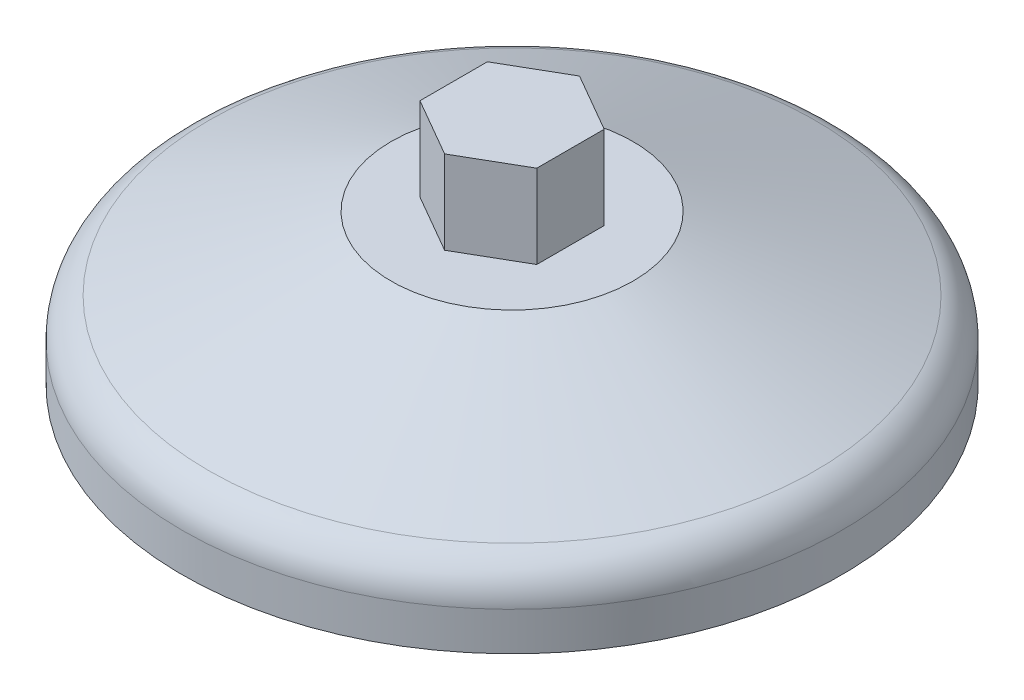
ISO-10303-21;
HEADER;
FILE_DESCRIPTION(('STEP AP214'),'2;1');
FILE_NAME('part.step','',(''),(''),'','','');
FILE_SCHEMA(('AUTOMOTIVE_DESIGN { 1 0 10303 214 1 1 1 1 }'));
ENDSEC;
DATA;
#1=APPLICATION_CONTEXT('core data for automotive mechanical design processes');
#2=APPLICATION_PROTOCOL_DEFINITION('international standard','automotive_design',2000,#1);
#3=PRODUCT_CONTEXT('',#1,'mechanical');
#4=PRODUCT('Part','Part','',(#3));
#5=PRODUCT_RELATED_PRODUCT_CATEGORY('part','',(#4));
#6=PRODUCT_DEFINITION_FORMATION('','',#4);
#7=PRODUCT_DEFINITION_CONTEXT('part definition',#1,'design');
#8=PRODUCT_DEFINITION('design','',#6,#7);
#9=PRODUCT_DEFINITION_SHAPE('','',#8);
#10=(LENGTH_UNIT() NAMED_UNIT(*) SI_UNIT(.MILLI.,.METRE.));
#11=(NAMED_UNIT(*) PLANE_ANGLE_UNIT() SI_UNIT($,.RADIAN.));
#12=(NAMED_UNIT(*) SI_UNIT($,.STERADIAN.) SOLID_ANGLE_UNIT());
#13=UNCERTAINTY_MEASURE_WITH_UNIT(LENGTH_MEASURE(1.E-05),#10,'distance_accuracy_value','');
#14=(GEOMETRIC_REPRESENTATION_CONTEXT(3) GLOBAL_UNCERTAINTY_ASSIGNED_CONTEXT((#13)) GLOBAL_UNIT_ASSIGNED_CONTEXT((#10,
#11,#12)) REPRESENTATION_CONTEXT('',''));
#15=CARTESIAN_POINT('',(0.,0.,0.));
#16=DIRECTION('',(0.,0.,1.));
#17=DIRECTION('',(1.,0.,0.));
#18=AXIS2_PLACEMENT_3D('',#15,#16,#17);
#19=CARTESIAN_POINT('',(-55.1774729901559,-66.5554283547376,-4.96013195530549));
#20=DIRECTION('',(0.,-1.,0.));
#21=DIRECTION('',(0.,0.,-1.));
#22=AXIS2_PLACEMENT_3D('',#19,#20,#21);
#23=PLANE('',#22);
#24=CARTESIAN_POINT('',(-55.1774729901559,-66.5554283547376,-4.96013195530549));
#25=DIRECTION('',(0.,1.,0.));
#26=DIRECTION('',(1.,0.,0.));
#27=AXIS2_PLACEMENT_3D('',#24,#25,#26);
#28=CIRCLE('',#27,39.5);
#29=CARTESIAN_POINT('',(-94.6774729901559,-66.5554283547376,-4.96013195530549));
#30=VERTEX_POINT('',#29);
#31=EDGE_CURVE('E10',#30,#30,#28,.T.);
#32=ORIENTED_EDGE('',*,*,#31,.F.);
#33=EDGE_LOOP('',(#32));
#34=FACE_BOUND('',#33,.T.);
#35=ADVANCED_FACE('F16',(#34),#23,.T.);
#36=CARTESIAN_POINT('',(-55.1774729901559,-48.5554283547376,-4.96013195530549));
#37=DIRECTION('',(0.,-1.,0.));
#38=DIRECTION('',(0.,0.,-1.));
#39=AXIS2_PLACEMENT_3D('',#36,#37,#38);
#40=PLANE('',#39);
#41=DIRECTION('',(0.,0.,-1.));
#42=VECTOR('',#41,1.);
#43=CARTESIAN_POINT('',(-48.1774729901559,-48.5554283547376,-6.9808578974692));
#44=LINE('',#43,#42);
#45=CARTESIAN_POINT('',(-48.1774729901559,-48.5554283547376,-0.918680070978194));
#46=VERTEX_POINT('',#45);
#47=CARTESIAN_POINT('',(-48.1774729901559,-48.5554283547376,-9.00158383963289));
#48=VERTEX_POINT('',#47);
#49=EDGE_CURVE('E150',#46,#48,#44,.T.);
#50=ORIENTED_EDGE('',*,*,#49,.F.);
#51=DIRECTION('',(0.866025403784439,0.,-0.5));
#52=VECTOR('',#51,1.);
#53=CARTESIAN_POINT('',(-49.9274729901559,-48.5554283547376,0.0916829001037026));
#54=LINE('',#53,#52);
#55=CARTESIAN_POINT('',(-55.1774729901559,-48.5554283547376,3.1227718133492));
#56=VERTEX_POINT('',#55);
#57=EDGE_CURVE('E20',#56,#46,#54,.T.);
#58=ORIENTED_EDGE('',*,*,#57,.F.);
#59=DIRECTION('',(0.866025403784439,0.,0.5));
#60=VECTOR('',#59,1.);
#61=CARTESIAN_POINT('',(-56.9274729901559,-48.5554283547376,2.11240884226731));
#62=LINE('',#61,#60);
#63=CARTESIAN_POINT('',(-62.1774729901559,-48.5554283547376,-0.918680070978194));
#64=VERTEX_POINT('',#63);
#65=EDGE_CURVE('E194',#64,#56,#62,.T.);
#66=ORIENTED_EDGE('',*,*,#65,.F.);
#67=DIRECTION('',(0.,0.,1.));
#68=VECTOR('',#67,1.);
#69=CARTESIAN_POINT('',(-62.1774729901559,-48.5554283547376,-2.9394060131419));
#70=LINE('',#69,#68);
#71=CARTESIAN_POINT('',(-62.1774729901559,-48.5554283547376,-9.00158383963289));
#72=VERTEX_POINT('',#71);
#73=EDGE_CURVE('E211',#72,#64,#70,.T.);
#74=ORIENTED_EDGE('',*,*,#73,.F.);
#75=DIRECTION('',(-0.866025403784439,0.,0.5));
#76=VECTOR('',#75,1.);
#77=CARTESIAN_POINT('',(-60.4274729901559,-48.5554283547376,-10.0119468107147));
#78=LINE('',#77,#76);
#79=CARTESIAN_POINT('',(-55.1774729901559,-48.5554283547376,-13.0430357239603));
#80=VERTEX_POINT('',#79);
#81=EDGE_CURVE('E168',#80,#72,#78,.T.);
#82=ORIENTED_EDGE('',*,*,#81,.F.);
#83=DIRECTION('',(-0.866025403784439,0.,-0.5));
#84=VECTOR('',#83,1.);
#85=CARTESIAN_POINT('',(-53.4274729901559,-48.5554283547376,-12.0326727528785));
#86=LINE('',#85,#84);
#87=EDGE_CURVE('E166',#48,#80,#86,.T.);
#88=ORIENTED_EDGE('',*,*,#87,.F.);
#89=EDGE_LOOP('',(#50,#58,#66,#74,#82,#88));
#90=FACE_BOUND('',#89,.T.);
#91=CARTESIAN_POINT('',(-55.1774729901559,-48.5554283547376,-4.96013195530549));
#92=DIRECTION('',(0.,1.,0.));
#93=DIRECTION('',(1.,0.,0.));
#94=AXIS2_PLACEMENT_3D('',#91,#92,#93);
#95=CIRCLE('',#94,14.5);
#96=CARTESIAN_POINT('',(-69.6774729901559,-48.5554283547376,-4.96013195530549));
#97=VERTEX_POINT('',#96);
#98=EDGE_CURVE('E130',#97,#97,#95,.T.);
#99=ORIENTED_EDGE('',*,*,#98,.T.);
#100=EDGE_LOOP('',(#99));
#101=FACE_BOUND('',#100,.T.);
#102=ADVANCED_FACE('F162',(#90,#101),#40,.F.);
#103=CARTESIAN_POINT('',(-55.1774729901559,-66.5554283547376,-4.96013195530549));
#104=DIRECTION('',(0.,-1.,0.));
#105=DIRECTION('',(1.,0.,0.));
#106=AXIS2_PLACEMENT_3D('',#103,#104,#105);
#107=CYLINDRICAL_SURFACE('',#106,39.5);
#108=CARTESIAN_POINT('',(-55.1774729901559,-61.9405931618721,-4.96013195530549));
#109=DIRECTION('',(0.,-1.,0.));
#110=DIRECTION('',(1.,0.,0.));
#111=AXIS2_PLACEMENT_3D('',#108,#109,#110);
#112=CIRCLE('',#111,39.5);
#113=CARTESIAN_POINT('',(-94.6774729901559,-61.9405931618721,-4.96013195530549));
#114=VERTEX_POINT('',#113);
#115=CARTESIAN_POINT('',(-55.1774729901559,-61.9405931618721,34.5398680446945));
#116=VERTEX_POINT('',#115);
#117=EDGE_CURVE('E128',#114,#116,#112,.T.);
#118=ORIENTED_EDGE('',*,*,#117,.T.);
#119=CARTESIAN_POINT('',(-55.1774729901559,-61.9405931618721,-4.96013195530549));
#120=DIRECTION('',(0.,-1.,0.));
#121=DIRECTION('',(1.,0.,0.));
#122=AXIS2_PLACEMENT_3D('',#119,#120,#121);
#123=CIRCLE('',#122,39.5);
#124=EDGE_CURVE('E121',#116,#114,#123,.T.);
#125=ORIENTED_EDGE('',*,*,#124,.T.);
#126=DIRECTION('',(0.,-1.,0.));
#127=VECTOR('',#126,1.);
#128=CARTESIAN_POINT('',(-94.6774729901559,-66.5554283547376,-4.96013195530549));
#129=LINE('',#128,#127);
#130=EDGE_CURVE('E26',#114,#30,#129,.T.);
#131=ORIENTED_EDGE('',*,*,#130,.T.);
#132=ORIENTED_EDGE('',*,*,#31,.T.);
#133=ORIENTED_EDGE('',*,*,#130,.F.);
#134=EDGE_LOOP('',(#118,#125,#131,#132,#133));
#135=FACE_BOUND('',#134,.T.);
#136=ADVANCED_FACE('F18',(#135),#107,.T.);
#137=CARTESIAN_POINT('',(-55.1774729901559,-53.5554283547376,-4.96013195530549));
#138=DIRECTION('',(0.,-1.,0.));
#139=DIRECTION('',(1.,0.,0.));
#140=AXIS2_PLACEMENT_3D('',#137,#138,#139);
#141=CONICAL_SURFACE('',#140,27.,1.19028994968253);
#142=ORIENTED_EDGE('',*,*,#98,.F.);
#143=DIRECTION('',(-0.928476690885259,-0.371390676354104,0.));
#144=VECTOR('',#143,1.);
#145=CARTESIAN_POINT('',(-82.1774729901559,-53.5554283547376,-4.96013195530549));
#146=LINE('',#145,#144);
#147=CARTESIAN_POINT('',(-91.5344263719269,-57.2982097074458,-4.96013195530549));
#148=VERTEX_POINT('',#147);
#149=EDGE_CURVE('E49',#97,#148,#146,.T.);
#150=ORIENTED_EDGE('',*,*,#149,.T.);
#151=CARTESIAN_POINT('',(-55.1774729901559,-57.2982097074458,-4.96013195530549));
#152=DIRECTION('',(0.,1.,0.));
#153=DIRECTION('',(1.,0.,0.));
#154=AXIS2_PLACEMENT_3D('',#151,#152,#153);
#155=CIRCLE('',#154,36.3569533817706);
#156=CARTESIAN_POINT('',(-55.1774729901559,-57.2982097074458,31.396821426465));
#157=VERTEX_POINT('',#156);
#158=EDGE_CURVE('E142',#148,#157,#155,.T.);
#159=ORIENTED_EDGE('',*,*,#158,.T.);
#160=CARTESIAN_POINT('',(-55.1774729901559,-57.2982097074458,-4.96013195530549));
#161=DIRECTION('',(0.,1.,0.));
#162=DIRECTION('',(1.,0.,0.));
#163=AXIS2_PLACEMENT_3D('',#160,#161,#162);
#164=CIRCLE('',#163,36.3569533817706);
#165=EDGE_CURVE('E134',#157,#148,#164,.T.);
#166=ORIENTED_EDGE('',*,*,#165,.T.);
#167=ORIENTED_EDGE('',*,*,#149,.F.);
#168=EDGE_LOOP('',(#142,#150,#159,#166,#167));
#169=FACE_BOUND('',#168,.T.);
#170=ADVANCED_FACE('F250',(#169),#141,.T.);
#171=CARTESIAN_POINT('',(-55.1774729901559,-61.9405931618721,-4.96013195530549));
#172=DIRECTION('',(0.,1.,0.));
#173=DIRECTION('',(0.,0.,-1.));
#174=AXIS2_PLACEMENT_3D('',#171,#172,#173);
#175=TOROIDAL_SURFACE('',#174,34.5,5.);
#176=ORIENTED_EDGE('',*,*,#158,.F.);
#177=ORIENTED_EDGE('',*,*,#165,.F.);
#178=CARTESIAN_POINT('',(-55.1774729901559,-61.9405931618721,29.5398680446945));
#179=DIRECTION('',(1.,0.,0.));
#180=DIRECTION('',(0.,0.,1.));
#181=AXIS2_PLACEMENT_3D('',#178,#179,#180);
#182=CIRCLE('',#181,5.);
#183=EDGE_CURVE('E126',#157,#116,#182,.T.);
#184=ORIENTED_EDGE('',*,*,#183,.T.);
#185=ORIENTED_EDGE('',*,*,#117,.F.);
#186=ORIENTED_EDGE('',*,*,#124,.F.);
#187=ORIENTED_EDGE('',*,*,#183,.F.);
#188=EDGE_LOOP('',(#176,#177,#184,#185,#186,#187));
#189=FACE_BOUND('',#188,.T.);
#190=ADVANCED_FACE('F124',(#189),#175,.T.);
#191=CARTESIAN_POINT('',(-55.1774729901559,-38.5554283547376,-4.96013195530549));
#192=DIRECTION('',(0.,-1.,0.));
#193=DIRECTION('',(0.,0.,-1.));
#194=AXIS2_PLACEMENT_3D('',#191,#192,#193);
#195=PLANE('',#194);
#196=DIRECTION('',(-0.866025403784439,0.,0.5));
#197=VECTOR('',#196,1.);
#198=CARTESIAN_POINT('',(-55.1774729901559,-38.5554283547376,3.1227718133492));
#199=LINE('',#198,#197);
#200=CARTESIAN_POINT('',(-48.1774729901559,-38.5554283547376,-0.918680070978194));
#201=VERTEX_POINT('',#200);
#202=CARTESIAN_POINT('',(-55.1774729901559,-38.5554283547376,3.1227718133492));
#203=VERTEX_POINT('',#202);
#204=EDGE_CURVE('E184',#201,#203,#199,.T.);
#205=ORIENTED_EDGE('',*,*,#204,.F.);
#206=DIRECTION('',(0.,0.,1.));
#207=VECTOR('',#206,1.);
#208=CARTESIAN_POINT('',(-48.1774729901559,-38.5554283547376,-0.918680070978194));
#209=LINE('',#208,#207);
#210=CARTESIAN_POINT('',(-48.1774729901559,-38.5554283547376,-9.00158383963289));
#211=VERTEX_POINT('',#210);
#212=EDGE_CURVE('E149',#211,#201,#209,.T.);
#213=ORIENTED_EDGE('',*,*,#212,.F.);
#214=DIRECTION('',(0.866025403784439,0.,0.5));
#215=VECTOR('',#214,1.);
#216=CARTESIAN_POINT('',(-48.1774729901559,-38.5554283547376,-9.00158383963289));
#217=LINE('',#216,#215);
#218=CARTESIAN_POINT('',(-55.1774729901559,-38.5554283547376,-13.0430357239603));
#219=VERTEX_POINT('',#218);
#220=EDGE_CURVE('E177',#219,#211,#217,.T.);
#221=ORIENTED_EDGE('',*,*,#220,.F.);
#222=DIRECTION('',(0.866025403784439,0.,-0.5));
#223=VECTOR('',#222,1.);
#224=CARTESIAN_POINT('',(-55.1774729901559,-38.5554283547376,-13.0430357239603));
#225=LINE('',#224,#223);
#226=CARTESIAN_POINT('',(-62.1774729901559,-38.5554283547376,-9.00158383963289));
#227=VERTEX_POINT('',#226);
#228=EDGE_CURVE('E207',#227,#219,#225,.T.);
#229=ORIENTED_EDGE('',*,*,#228,.F.);
#230=DIRECTION('',(0.,0.,-1.));
#231=VECTOR('',#230,1.);
#232=CARTESIAN_POINT('',(-62.1774729901559,-38.5554283547376,-9.00158383963289));
#233=LINE('',#232,#231);
#234=CARTESIAN_POINT('',(-62.1774729901559,-38.5554283547376,-0.918680070978194));
#235=VERTEX_POINT('',#234);
#236=EDGE_CURVE('E199',#235,#227,#233,.T.);
#237=ORIENTED_EDGE('',*,*,#236,.F.);
#238=DIRECTION('',(-0.866025403784439,0.,-0.5));
#239=VECTOR('',#238,1.);
#240=CARTESIAN_POINT('',(-62.1774729901559,-38.5554283547376,-0.918680070978194));
#241=LINE('',#240,#239);
#242=EDGE_CURVE('E112',#203,#235,#241,.T.);
#243=ORIENTED_EDGE('',*,*,#242,.F.);
#244=EDGE_LOOP('',(#205,#213,#221,#229,#237,#243));
#245=FACE_BOUND('',#244,.T.);
#246=ADVANCED_FACE('F183',(#245),#195,.F.);
#247=CARTESIAN_POINT('',(-48.1774729901559,-48.5554283547376,-0.918680070978096));
#248=DIRECTION('',(-0.5,0.,-0.866025403784439));
#249=DIRECTION('',(-0.866025403784439,0.,0.5));
#250=AXIS2_PLACEMENT_3D('',#247,#248,#249);
#251=PLANE('',#250);
#252=ORIENTED_EDGE('',*,*,#57,.T.);
#253=DIRECTION('',(0.,1.,0.));
#254=VECTOR('',#253,1.);
#255=CARTESIAN_POINT('',(-48.1774729901559,-48.5554283547376,-0.918680070978194));
#256=LINE('',#255,#254);
#257=EDGE_CURVE('E161',#46,#201,#256,.T.);
#258=ORIENTED_EDGE('',*,*,#257,.T.);
#259=ORIENTED_EDGE('',*,*,#204,.T.);
#260=DIRECTION('',(0.,1.,0.));
#261=VECTOR('',#260,1.);
#262=CARTESIAN_POINT('',(-55.1774729901559,-48.5554283547376,3.1227718133492));
#263=LINE('',#262,#261);
#264=EDGE_CURVE('E198',#56,#203,#263,.T.);
#265=ORIENTED_EDGE('',*,*,#264,.F.);
#266=EDGE_LOOP('',(#252,#258,#259,#265));
#267=FACE_BOUND('',#266,.T.);
#268=ADVANCED_FACE('F220',(#267),#251,.F.);
#269=CARTESIAN_POINT('',(-55.1774729901559,-48.5554283547376,3.1227718133492));
#270=DIRECTION('',(0.5,0.,-0.866025403784439));
#271=DIRECTION('',(0.,-1.,0.));
#272=AXIS2_PLACEMENT_3D('',#269,#270,#271);
#273=PLANE('',#272);
#274=ORIENTED_EDGE('',*,*,#65,.T.);
#275=ORIENTED_EDGE('',*,*,#264,.T.);
#276=ORIENTED_EDGE('',*,*,#242,.T.);
#277=DIRECTION('',(0.,1.,0.));
#278=VECTOR('',#277,1.);
#279=CARTESIAN_POINT('',(-62.1774729901559,-48.5554283547376,-0.918680070978194));
#280=LINE('',#279,#278);
#281=EDGE_CURVE('E214',#64,#235,#280,.T.);
#282=ORIENTED_EDGE('',*,*,#281,.F.);
#283=EDGE_LOOP('',(#274,#275,#276,#282));
#284=FACE_BOUND('',#283,.T.);
#285=ADVANCED_FACE('F221',(#284),#273,.F.);
#286=CARTESIAN_POINT('',(-62.1774729901559,-48.5554283547376,-0.918680070978194));
#287=DIRECTION('',(1.,0.,0.));
#288=DIRECTION('',(0.,0.,1.));
#289=AXIS2_PLACEMENT_3D('',#286,#287,#288);
#290=PLANE('',#289);
#291=ORIENTED_EDGE('',*,*,#73,.T.);
#292=ORIENTED_EDGE('',*,*,#281,.T.);
#293=ORIENTED_EDGE('',*,*,#236,.T.);
#294=DIRECTION('',(0.,1.,0.));
#295=VECTOR('',#294,1.);
#296=CARTESIAN_POINT('',(-62.1774729901559,-48.5554283547376,-9.00158383963289));
#297=LINE('',#296,#295);
#298=EDGE_CURVE('E204',#72,#227,#297,.T.);
#299=ORIENTED_EDGE('',*,*,#298,.F.);
#300=EDGE_LOOP('',(#291,#292,#293,#299));
#301=FACE_BOUND('',#300,.T.);
#302=ADVANCED_FACE('F225',(#301),#290,.F.);
#303=CARTESIAN_POINT('',(-62.1774729901559,-48.5554283547376,-9.00158383963289));
#304=DIRECTION('',(0.5,0.,0.866025403784439));
#305=DIRECTION('',(0.,-1.,0.));
#306=AXIS2_PLACEMENT_3D('',#303,#304,#305);
#307=PLANE('',#306);
#308=ORIENTED_EDGE('',*,*,#81,.T.);
#309=ORIENTED_EDGE('',*,*,#298,.T.);
#310=ORIENTED_EDGE('',*,*,#228,.T.);
#311=DIRECTION('',(0.,1.,0.));
#312=VECTOR('',#311,1.);
#313=CARTESIAN_POINT('',(-55.1774729901559,-48.5554283547376,-13.0430357239603));
#314=LINE('',#313,#312);
#315=EDGE_CURVE('E173',#80,#219,#314,.T.);
#316=ORIENTED_EDGE('',*,*,#315,.F.);
#317=EDGE_LOOP('',(#308,#309,#310,#316));
#318=FACE_BOUND('',#317,.T.);
#319=ADVANCED_FACE('F228',(#318),#307,.F.);
#320=CARTESIAN_POINT('',(-55.1774729901559,-48.5554283547376,-13.0430357239603));
#321=DIRECTION('',(-0.5,0.,0.866025403784439));
#322=DIRECTION('',(0.,1.,0.));
#323=AXIS2_PLACEMENT_3D('',#320,#321,#322);
#324=PLANE('',#323);
#325=ORIENTED_EDGE('',*,*,#87,.T.);
#326=ORIENTED_EDGE('',*,*,#315,.T.);
#327=ORIENTED_EDGE('',*,*,#220,.T.);
#328=DIRECTION('',(0.,1.,0.));
#329=VECTOR('',#328,1.);
#330=CARTESIAN_POINT('',(-48.1774729901559,-48.5554283547376,-9.00158383963289));
#331=LINE('',#330,#329);
#332=EDGE_CURVE('E147',#48,#211,#331,.T.);
#333=ORIENTED_EDGE('',*,*,#332,.F.);
#334=EDGE_LOOP('',(#325,#326,#327,#333));
#335=FACE_BOUND('',#334,.T.);
#336=ADVANCED_FACE('F175',(#335),#324,.F.);
#337=CARTESIAN_POINT('',(-48.1774729901559,-48.5554283547376,-9.00158383963289));
#338=DIRECTION('',(-1.,0.,0.));
#339=DIRECTION('',(0.,1.,0.));
#340=AXIS2_PLACEMENT_3D('',#337,#338,#339);
#341=PLANE('',#340);
#342=ORIENTED_EDGE('',*,*,#49,.T.);
#343=ORIENTED_EDGE('',*,*,#332,.T.);
#344=ORIENTED_EDGE('',*,*,#212,.T.);
#345=ORIENTED_EDGE('',*,*,#257,.F.);
#346=EDGE_LOOP('',(#342,#343,#344,#345));
#347=FACE_BOUND('',#346,.T.);
#348=ADVANCED_FACE('F157',(#347),#341,.F.);
#349=CLOSED_SHELL('',(#35,#102,#136,#170,#190,#246,#268,#285,#302,#319,#336,#348));
#350=MANIFOLD_SOLID_BREP('B1',#349);
#351=ADVANCED_BREP_SHAPE_REPRESENTATION('',(#18,#350),#14);
#352=SHAPE_DEFINITION_REPRESENTATION(#9,#351);
ENDSEC;
END-ISO-10303-21;
